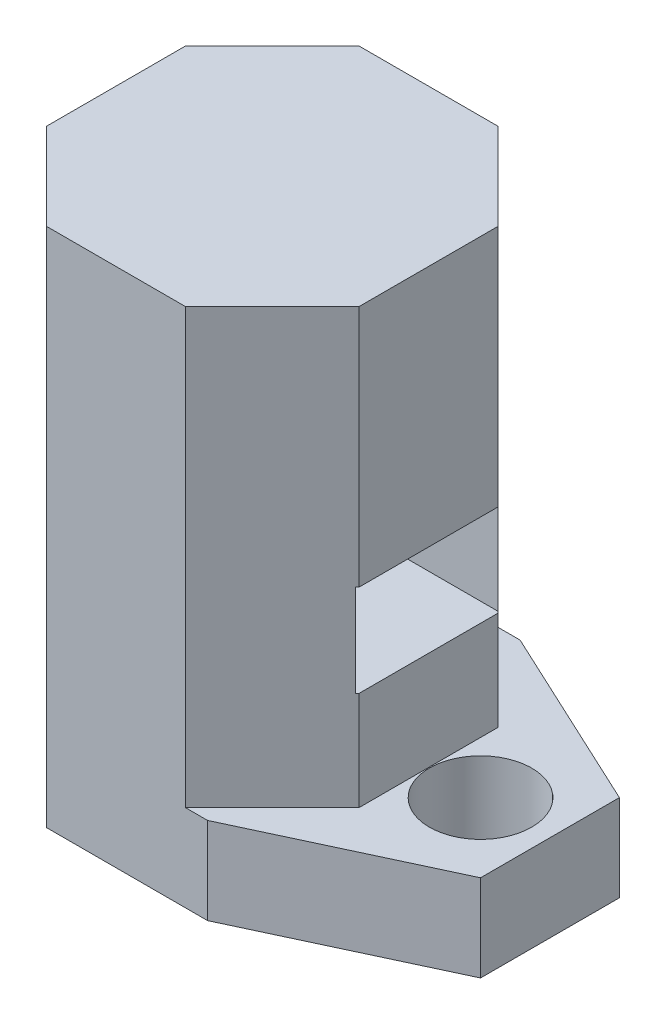
ISO-10303-21;
HEADER;
FILE_DESCRIPTION(('STEP AP214'),'2;1');
FILE_NAME('part.step','',(''),(''),'','','');
FILE_SCHEMA(('AUTOMOTIVE_DESIGN { 1 0 10303 214 1 1 1 1 }'));
ENDSEC;
DATA;
#1=APPLICATION_CONTEXT('core data for automotive mechanical design processes');
#2=APPLICATION_PROTOCOL_DEFINITION('international standard','automotive_design',2000,#1);
#3=PRODUCT_CONTEXT('',#1,'mechanical');
#4=PRODUCT('Part','Part','',(#3));
#5=PRODUCT_RELATED_PRODUCT_CATEGORY('part','',(#4));
#6=PRODUCT_DEFINITION_FORMATION('','',#4);
#7=PRODUCT_DEFINITION_CONTEXT('part definition',#1,'design');
#8=PRODUCT_DEFINITION('design','',#6,#7);
#9=PRODUCT_DEFINITION_SHAPE('','',#8);
#10=(LENGTH_UNIT() NAMED_UNIT(*) SI_UNIT(.MILLI.,.METRE.));
#11=(NAMED_UNIT(*) PLANE_ANGLE_UNIT() SI_UNIT($,.RADIAN.));
#12=(NAMED_UNIT(*) SI_UNIT($,.STERADIAN.) SOLID_ANGLE_UNIT());
#13=UNCERTAINTY_MEASURE_WITH_UNIT(LENGTH_MEASURE(1.E-05),#10,'distance_accuracy_value','');
#14=(GEOMETRIC_REPRESENTATION_CONTEXT(3) GLOBAL_UNCERTAINTY_ASSIGNED_CONTEXT((#13)) GLOBAL_UNIT_ASSIGNED_CONTEXT((#10,
#11,#12)) REPRESENTATION_CONTEXT('',''));
#15=CARTESIAN_POINT('',(0.,0.,0.));
#16=DIRECTION('',(0.,0.,1.));
#17=DIRECTION('',(1.,0.,0.));
#18=AXIS2_PLACEMENT_3D('',#15,#16,#17);
#19=CARTESIAN_POINT('',(3.99999999999999,0.,9.));
#20=DIRECTION('',(-1.,0.,0.));
#21=DIRECTION('',(0.,-1.,0.));
#22=AXIS2_PLACEMENT_3D('',#19,#20,#21);
#23=PLANE('',#22);
#24=DIRECTION('',(0.,0.,-1.));
#25=VECTOR('',#24,1.);
#26=CARTESIAN_POINT('',(4.,-25.,3.99999999999998));
#27=LINE('',#26,#25);
#28=CARTESIAN_POINT('',(4.,-25.,3.99999999999998));
#29=VERTEX_POINT('',#28);
#30=CARTESIAN_POINT('',(4.,-25.,-3.99999999999999));
#31=VERTEX_POINT('',#30);
#32=EDGE_CURVE('E380',#29,#31,#27,.T.);
#33=ORIENTED_EDGE('',*,*,#32,.T.);
#34=DIRECTION('',(0.,1.,0.));
#35=VECTOR('',#34,1.);
#36=CARTESIAN_POINT('',(3.99999999999999,0.,-3.99999999999991));
#37=LINE('',#36,#35);
#38=CARTESIAN_POINT('',(3.99999999999999,-19.3,-3.99999999999992));
#39=VERTEX_POINT('',#38);
#40=EDGE_CURVE('E187',#31,#39,#37,.T.);
#41=ORIENTED_EDGE('',*,*,#40,.T.);
#42=DIRECTION('',(0.,0.,-1.));
#43=VECTOR('',#42,1.);
#44=CARTESIAN_POINT('',(3.99999999999999,-19.3,4.1));
#45=LINE('',#44,#43);
#46=CARTESIAN_POINT('',(3.99999999999999,-19.3,3.99999999999996));
#47=VERTEX_POINT('',#46);
#48=EDGE_CURVE('E346',#47,#39,#45,.T.);
#49=ORIENTED_EDGE('',*,*,#48,.F.);
#50=DIRECTION('',(0.,-1.,0.));
#51=VECTOR('',#50,1.);
#52=CARTESIAN_POINT('',(3.99999999999999,0.,3.99999999999996));
#53=LINE('',#52,#51);
#54=EDGE_CURVE('E197',#47,#29,#53,.T.);
#55=ORIENTED_EDGE('',*,*,#54,.T.);
#56=EDGE_LOOP('',(#33,#41,#49,#55));
#57=FACE_BOUND('',#56,.T.);
#58=ADVANCED_FACE('F33',(#57),#23,.F.);
#59=CARTESIAN_POINT('',(3.99999999999999,0.,-3.99999999999991));
#60=DIRECTION('',(0.707106781186551,0.,-0.707106781186544));
#61=DIRECTION('',(0.,-1.,0.));
#62=AXIS2_PLACEMENT_3D('',#59,#60,#61);
#63=PLANE('',#62);
#64=ORIENTED_EDGE('',*,*,#40,.F.);
#65=DIRECTION('',(-0.707106781186549,0.,-0.707106781186547));
#66=VECTOR('',#65,1.);
#67=CARTESIAN_POINT('',(4.,-25.,-3.99999999999999));
#68=LINE('',#67,#66);
#69=CARTESIAN_POINT('',(-1.00000000000002,-25.,-9.));
#70=VERTEX_POINT('',#69);
#71=EDGE_CURVE('E171',#31,#70,#68,.T.);
#72=ORIENTED_EDGE('',*,*,#71,.T.);
#73=DIRECTION('',(0.,-1.,0.));
#74=VECTOR('',#73,1.);
#75=CARTESIAN_POINT('',(-1.00000000000004,-30.,-9.));
#76=LINE('',#75,#74);
#77=CARTESIAN_POINT('',(-1.00000000000004,0.,-9.));
#78=VERTEX_POINT('',#77);
#79=EDGE_CURVE('E185',#78,#70,#76,.T.);
#80=ORIENTED_EDGE('',*,*,#79,.F.);
#81=DIRECTION('',(-0.707106781186544,0.,-0.707106781186551));
#82=VECTOR('',#81,1.);
#83=CARTESIAN_POINT('',(3.99999999999999,0.,-3.99999999999991));
#84=LINE('',#83,#82);
#85=CARTESIAN_POINT('',(3.99999999999999,0.,-3.99999999999991));
#86=VERTEX_POINT('',#85);
#87=EDGE_CURVE('E302',#86,#78,#84,.T.);
#88=ORIENTED_EDGE('',*,*,#87,.F.);
#89=DIRECTION('',(0.,1.,0.));
#90=VECTOR('',#89,1.);
#91=CARTESIAN_POINT('',(3.99999999999999,0.,-3.99999999999991));
#92=LINE('',#91,#90);
#93=CARTESIAN_POINT('',(3.99999999999999,-14.,-3.99999999999991));
#94=VERTEX_POINT('',#93);
#95=EDGE_CURVE('E207',#94,#86,#92,.T.);
#96=ORIENTED_EDGE('',*,*,#95,.F.);
#97=DIRECTION('',(0.707106781186544,0.,0.707106781186551));
#98=VECTOR('',#97,1.);
#99=CARTESIAN_POINT('',(3.99999999999999,-14.,-3.99999999999991));
#100=LINE('',#99,#98);
#101=CARTESIAN_POINT('',(3.8999999999999,-14.,-4.1));
#102=VERTEX_POINT('',#101);
#103=EDGE_CURVE('E294',#102,#94,#100,.T.);
#104=ORIENTED_EDGE('',*,*,#103,.F.);
#105=DIRECTION('',(0.,1.,0.));
#106=VECTOR('',#105,1.);
#107=CARTESIAN_POINT('',(3.89999999999991,0.,-4.1));
#108=LINE('',#107,#106);
#109=CARTESIAN_POINT('',(3.89999999999991,-19.3,-4.1));
#110=VERTEX_POINT('',#109);
#111=EDGE_CURVE('E199',#110,#102,#108,.T.);
#112=ORIENTED_EDGE('',*,*,#111,.F.);
#113=DIRECTION('',(-0.707106781186544,0.,-0.707106781186551));
#114=VECTOR('',#113,1.);
#115=CARTESIAN_POINT('',(3.99999999999999,-19.3,-3.99999999999992));
#116=LINE('',#115,#114);
#117=EDGE_CURVE('E282',#39,#110,#116,.T.);
#118=ORIENTED_EDGE('',*,*,#117,.F.);
#119=EDGE_LOOP('',(#64,#72,#80,#88,#96,#104,#112,#118));
#120=FACE_BOUND('',#119,.T.);
#121=ADVANCED_FACE('F183',(#120),#63,.T.);
#122=CARTESIAN_POINT('',(-1.0000000000001,0.,9.));
#123=DIRECTION('',(-0.707106781186544,0.,-0.707106781186551));
#124=DIRECTION('',(0.,1.,0.));
#125=AXIS2_PLACEMENT_3D('',#122,#123,#124);
#126=PLANE('',#125);
#127=DIRECTION('',(0.,1.,0.));
#128=VECTOR('',#127,1.);
#129=CARTESIAN_POINT('',(-1.0000000000001,0.,9.));
#130=LINE('',#129,#128);
#131=CARTESIAN_POINT('',(-1.00000000000001,-25.,9.));
#132=VERTEX_POINT('',#131);
#133=CARTESIAN_POINT('',(-1.0000000000001,0.,9.));
#134=VERTEX_POINT('',#133);
#135=EDGE_CURVE('E258',#132,#134,#130,.T.);
#136=ORIENTED_EDGE('',*,*,#135,.F.);
#137=DIRECTION('',(0.707106781186546,0.,-0.707106781186549));
#138=VECTOR('',#137,1.);
#139=CARTESIAN_POINT('',(-1.00000000000001,-25.,9.));
#140=LINE('',#139,#138);
#141=EDGE_CURVE('E384',#132,#29,#140,.T.);
#142=ORIENTED_EDGE('',*,*,#141,.T.);
#143=ORIENTED_EDGE('',*,*,#54,.F.);
#144=DIRECTION('',(-0.707106781186551,0.,0.707106781186544));
#145=VECTOR('',#144,1.);
#146=CARTESIAN_POINT('',(-1.00000000000009,-19.3,9.));
#147=LINE('',#146,#145);
#148=CARTESIAN_POINT('',(3.89999999999996,-19.3,4.1));
#149=VERTEX_POINT('',#148);
#150=EDGE_CURVE('E280',#149,#47,#147,.F.);
#151=ORIENTED_EDGE('',*,*,#150,.F.);
#152=DIRECTION('',(0.,1.,0.));
#153=VECTOR('',#152,1.);
#154=CARTESIAN_POINT('',(3.89999999999995,0.,4.1));
#155=LINE('',#154,#153);
#156=CARTESIAN_POINT('',(3.89999999999996,-14.,4.1));
#157=VERTEX_POINT('',#156);
#158=EDGE_CURVE('E288',#157,#149,#155,.F.);
#159=ORIENTED_EDGE('',*,*,#158,.F.);
#160=DIRECTION('',(0.707106781186551,0.,-0.707106781186544));
#161=VECTOR('',#160,1.);
#162=CARTESIAN_POINT('',(-1.00000000000009,-14.,9.));
#163=LINE('',#162,#161);
#164=CARTESIAN_POINT('',(3.99999999999999,-14.,3.99999999999996));
#165=VERTEX_POINT('',#164);
#166=EDGE_CURVE('E292',#165,#157,#163,.F.);
#167=ORIENTED_EDGE('',*,*,#166,.F.);
#168=DIRECTION('',(0.,-1.,0.));
#169=VECTOR('',#168,1.);
#170=CARTESIAN_POINT('',(3.99999999999999,0.,3.99999999999996));
#171=LINE('',#170,#169);
#172=CARTESIAN_POINT('',(3.99999999999999,0.,3.99999999999996));
#173=VERTEX_POINT('',#172);
#174=EDGE_CURVE('E205',#173,#165,#171,.T.);
#175=ORIENTED_EDGE('',*,*,#174,.F.);
#176=DIRECTION('',(-0.707106781186551,0.,0.707106781186544));
#177=VECTOR('',#176,1.);
#178=CARTESIAN_POINT('',(-1.0000000000001,0.,9.));
#179=LINE('',#178,#177);
#180=EDGE_CURVE('E300',#134,#173,#179,.F.);
#181=ORIENTED_EDGE('',*,*,#180,.F.);
#182=EDGE_LOOP('',(#136,#142,#143,#151,#159,#167,#175,#181));
#183=FACE_BOUND('',#182,.T.);
#184=ADVANCED_FACE('F340',(#183),#126,.F.);
#185=CARTESIAN_POINT('',(-14.,-30.,9.));
#186=DIRECTION('',(1.,0.,0.));
#187=DIRECTION('',(0.,1.,0.));
#188=AXIS2_PLACEMENT_3D('',#185,#186,#187);
#189=PLANE('',#188);
#190=DIRECTION('',(0.,0.,-1.));
#191=VECTOR('',#190,1.);
#192=CARTESIAN_POINT('',(-14.,-30.,9.));
#193=LINE('',#192,#191);
#194=CARTESIAN_POINT('',(-14.,-30.,3.99999999999996));
#195=VERTEX_POINT('',#194);
#196=CARTESIAN_POINT('',(-14.,-30.,-3.99999999999991));
#197=VERTEX_POINT('',#196);
#198=EDGE_CURVE('E253',#195,#197,#193,.T.);
#199=ORIENTED_EDGE('',*,*,#198,.F.);
#200=DIRECTION('',(0.,1.,0.));
#201=VECTOR('',#200,1.);
#202=CARTESIAN_POINT('',(-14.,-30.,3.99999999999996));
#203=LINE('',#202,#201);
#204=CARTESIAN_POINT('',(-14.,-19.3,3.99999999999996));
#205=VERTEX_POINT('',#204);
#206=EDGE_CURVE('E278',#195,#205,#203,.T.);
#207=ORIENTED_EDGE('',*,*,#206,.T.);
#208=DIRECTION('',(0.,0.,1.));
#209=VECTOR('',#208,1.);
#210=CARTESIAN_POINT('',(-14.,-19.3,4.1));
#211=LINE('',#210,#209);
#212=CARTESIAN_POINT('',(-14.,-19.3,-3.99999999999991));
#213=VERTEX_POINT('',#212);
#214=EDGE_CURVE('E360',#213,#205,#211,.T.);
#215=ORIENTED_EDGE('',*,*,#214,.F.);
#216=DIRECTION('',(0.,-1.,0.));
#217=VECTOR('',#216,1.);
#218=CARTESIAN_POINT('',(-14.,-30.,-3.99999999999991));
#219=LINE('',#218,#217);
#220=EDGE_CURVE('E271',#213,#197,#219,.T.);
#221=ORIENTED_EDGE('',*,*,#220,.T.);
#222=EDGE_LOOP('',(#199,#207,#215,#221));
#223=FACE_BOUND('',#222,.T.);
#224=ADVANCED_FACE('F405',(#223),#189,.F.);
#225=CARTESIAN_POINT('',(-14.,0.,9.));
#226=DIRECTION('',(0.,-1.,0.));
#227=DIRECTION('',(1.,0.,0.));
#228=AXIS2_PLACEMENT_3D('',#225,#226,#227);
#229=PLANE('',#228);
#230=DIRECTION('',(0.,0.,-1.));
#231=VECTOR('',#230,1.);
#232=CARTESIAN_POINT('',(-14.,0.,9.));
#233=LINE('',#232,#231);
#234=CARTESIAN_POINT('',(-14.,0.,3.99999999999996));
#235=VERTEX_POINT('',#234);
#236=CARTESIAN_POINT('',(-14.,0.,-3.99999999999991));
#237=VERTEX_POINT('',#236);
#238=EDGE_CURVE('E255',#235,#237,#233,.T.);
#239=ORIENTED_EDGE('',*,*,#238,.F.);
#240=DIRECTION('',(-0.707106781186551,0.,-0.707106781186544));
#241=VECTOR('',#240,1.);
#242=CARTESIAN_POINT('',(-8.99999999999991,0.,9.));
#243=LINE('',#242,#241);
#244=CARTESIAN_POINT('',(-8.99999999999991,0.,9.));
#245=VERTEX_POINT('',#244);
#246=EDGE_CURVE('E306',#235,#245,#243,.F.);
#247=ORIENTED_EDGE('',*,*,#246,.T.);
#248=DIRECTION('',(-1.,0.,0.));
#249=VECTOR('',#248,1.);
#250=CARTESIAN_POINT('',(-14.,0.,9.));
#251=LINE('',#250,#249);
#252=EDGE_CURVE('E241',#134,#245,#251,.T.);
#253=ORIENTED_EDGE('',*,*,#252,.F.);
#254=ORIENTED_EDGE('',*,*,#180,.T.);
#255=DIRECTION('',(0.,0.,-1.));
#256=VECTOR('',#255,1.);
#257=CARTESIAN_POINT('',(3.99999999999999,0.,9.));
#258=LINE('',#257,#256);
#259=EDGE_CURVE('E250',#173,#86,#258,.T.);
#260=ORIENTED_EDGE('',*,*,#259,.T.);
#261=ORIENTED_EDGE('',*,*,#87,.T.);
#262=DIRECTION('',(-1.,0.,0.));
#263=VECTOR('',#262,1.);
#264=CARTESIAN_POINT('',(-14.,0.,-9.));
#265=LINE('',#264,#263);
#266=CARTESIAN_POINT('',(-8.99999999999996,0.,-9.));
#267=VERTEX_POINT('',#266);
#268=EDGE_CURVE('E193',#78,#267,#265,.T.);
#269=ORIENTED_EDGE('',*,*,#268,.T.);
#270=DIRECTION('',(-0.707106781186544,0.,0.707106781186551));
#271=VECTOR('',#270,1.);
#272=CARTESIAN_POINT('',(-14.,0.,-3.99999999999991));
#273=LINE('',#272,#271);
#274=EDGE_CURVE('E304',#267,#237,#273,.T.);
#275=ORIENTED_EDGE('',*,*,#274,.T.);
#276=EDGE_LOOP('',(#239,#247,#253,#254,#260,#261,#269,#275));
#277=FACE_BOUND('',#276,.T.);
#278=ADVANCED_FACE('F335',(#277),#229,.F.);
#279=DIRECTION('',(0.,0.,-1.));
#280=VECTOR('',#279,1.);
#281=CARTESIAN_POINT('',(-14.,-14.,4.1));
#282=LINE('',#281,#280);
#283=CARTESIAN_POINT('',(-14.,-14.,3.99999999999996));
#284=VERTEX_POINT('',#283);
#285=CARTESIAN_POINT('',(-14.,-14.,-3.99999999999991));
#286=VERTEX_POINT('',#285);
#287=EDGE_CURVE('E351',#284,#286,#282,.T.);
#288=ORIENTED_EDGE('',*,*,#287,.F.);
#289=DIRECTION('',(0.,1.,0.));
#290=VECTOR('',#289,1.);
#291=CARTESIAN_POINT('',(-14.,-30.,3.99999999999996));
#292=LINE('',#291,#290);
#293=EDGE_CURVE('E276',#284,#235,#292,.T.);
#294=ORIENTED_EDGE('',*,*,#293,.T.);
#295=ORIENTED_EDGE('',*,*,#238,.T.);
#296=DIRECTION('',(0.,-1.,0.));
#297=VECTOR('',#296,1.);
#298=CARTESIAN_POINT('',(-14.,-30.,-3.99999999999991));
#299=LINE('',#298,#297);
#300=EDGE_CURVE('E273',#237,#286,#299,.T.);
#301=ORIENTED_EDGE('',*,*,#300,.T.);
#302=EDGE_LOOP('',(#288,#294,#295,#301));
#303=FACE_BOUND('',#302,.T.);
#304=ADVANCED_FACE('F395',(#303),#189,.F.);
#305=CARTESIAN_POINT('',(4.,-30.,9.));
#306=DIRECTION('',(0.,1.,0.));
#307=DIRECTION('',(-1.,0.,0.));
#308=AXIS2_PLACEMENT_3D('',#305,#306,#307);
#309=PLANE('',#308);
#310=CARTESIAN_POINT('',(-5.,-30.,0.));
#311=DIRECTION('',(0.,-1.,0.));
#312=DIRECTION('',(1.,0.,0.));
#313=AXIS2_PLACEMENT_3D('',#310,#311,#312);
#314=CIRCLE('',#313,5.25);
#315=CARTESIAN_POINT('',(0.249999999999997,-30.,0.));
#316=VERTEX_POINT('',#315);
#317=EDGE_CURVE('E262',#316,#316,#314,.T.);
#318=ORIENTED_EDGE('',*,*,#317,.F.);
#319=EDGE_LOOP('',(#318));
#320=FACE_BOUND('',#319,.T.);
#321=DIRECTION('',(1.,0.,0.));
#322=VECTOR('',#321,1.);
#323=CARTESIAN_POINT('',(4.,-30.,-9.));
#324=LINE('',#323,#322);
#325=CARTESIAN_POINT('',(-8.99999999999997,-30.,-9.));
#326=VERTEX_POINT('',#325);
#327=CARTESIAN_POINT('',(0.277465397452219,-30.,-9.));
#328=VERTEX_POINT('',#327);
#329=EDGE_CURVE('E233',#326,#328,#324,.T.);
#330=ORIENTED_EDGE('',*,*,#329,.T.);
#331=DIRECTION('',(-0.90630778703665,0.,-0.4226182617407));
#332=VECTOR('',#331,1.);
#333=CARTESIAN_POINT('',(0.277465397452216,-30.,-9.));
#334=LINE('',#333,#332);
#335=CARTESIAN_POINT('',(11.,-30.,-3.99999999999999));
#336=VERTEX_POINT('',#335);
#337=EDGE_CURVE('E214',#328,#336,#334,.F.);
#338=ORIENTED_EDGE('',*,*,#337,.T.);
#339=DIRECTION('',(0.,0.,1.));
#340=VECTOR('',#339,1.);
#341=CARTESIAN_POINT('',(11.,-30.,-9.));
#342=LINE('',#341,#340);
#343=CARTESIAN_POINT('',(11.,-30.,3.99999999999999));
#344=VERTEX_POINT('',#343);
#345=EDGE_CURVE('E188',#336,#344,#342,.T.);
#346=ORIENTED_EDGE('',*,*,#345,.T.);
#347=DIRECTION('',(-0.90630778703665,0.,0.4226182617407));
#348=VECTOR('',#347,1.);
#349=CARTESIAN_POINT('',(11.,-30.,3.99999999999999));
#350=LINE('',#349,#348);
#351=CARTESIAN_POINT('',(0.277465397452216,-30.,9.));
#352=VERTEX_POINT('',#351);
#353=EDGE_CURVE('E212',#344,#352,#350,.T.);
#354=ORIENTED_EDGE('',*,*,#353,.T.);
#355=DIRECTION('',(1.,0.,0.));
#356=VECTOR('',#355,1.);
#357=CARTESIAN_POINT('',(4.,-30.,9.));
#358=LINE('',#357,#356);
#359=CARTESIAN_POINT('',(-8.99999999999991,-30.,9.));
#360=VERTEX_POINT('',#359);
#361=EDGE_CURVE('E244',#360,#352,#358,.T.);
#362=ORIENTED_EDGE('',*,*,#361,.F.);
#363=DIRECTION('',(0.707106781186551,0.,0.707106781186544));
#364=VECTOR('',#363,1.);
#365=CARTESIAN_POINT('',(-8.99999999999991,-30.,9.00000000000001));
#366=LINE('',#365,#364);
#367=EDGE_CURVE('E269',#360,#195,#366,.F.);
#368=ORIENTED_EDGE('',*,*,#367,.T.);
#369=ORIENTED_EDGE('',*,*,#198,.T.);
#370=DIRECTION('',(0.707106781186544,0.,-0.707106781186551));
#371=VECTOR('',#370,1.);
#372=CARTESIAN_POINT('',(-14.,-30.,-3.99999999999991));
#373=LINE('',#372,#371);
#374=EDGE_CURVE('E240',#197,#326,#373,.T.);
#375=ORIENTED_EDGE('',*,*,#374,.T.);
#376=EDGE_LOOP('',(#330,#338,#346,#354,#362,#368,#369,#375));
#377=FACE_BOUND('',#376,.T.);
#378=CARTESIAN_POINT('',(7.,-30.,0.));
#379=DIRECTION('',(0.,-1.,0.));
#380=DIRECTION('',(1.,0.,0.));
#381=AXIS2_PLACEMENT_3D('',#378,#379,#380);
#382=CIRCLE('',#381,2.95);
#383=CARTESIAN_POINT('',(9.95,-30.,0.));
#384=VERTEX_POINT('',#383);
#385=EDGE_CURVE('E376',#384,#384,#382,.T.);
#386=ORIENTED_EDGE('',*,*,#385,.F.);
#387=EDGE_LOOP('',(#386));
#388=FACE_BOUND('',#387,.T.);
#389=ADVANCED_FACE('F236',(#320,#377,#388),#309,.F.);
#390=DIRECTION('',(0.,0.,1.));
#391=VECTOR('',#390,1.);
#392=CARTESIAN_POINT('',(3.99999999999999,-14.,4.1));
#393=LINE('',#392,#391);
#394=EDGE_CURVE('E332',#94,#165,#393,.T.);
#395=ORIENTED_EDGE('',*,*,#394,.F.);
#396=ORIENTED_EDGE('',*,*,#95,.T.);
#397=ORIENTED_EDGE('',*,*,#259,.F.);
#398=ORIENTED_EDGE('',*,*,#174,.T.);
#399=EDGE_LOOP('',(#395,#396,#397,#398));
#400=FACE_BOUND('',#399,.T.);
#401=ADVANCED_FACE('F330',(#400),#23,.F.);
#402=CARTESIAN_POINT('',(0.,0.,9.));
#403=DIRECTION('',(0.,0.,-1.));
#404=DIRECTION('',(-1.,0.,0.));
#405=AXIS2_PLACEMENT_3D('',#402,#403,#404);
#406=PLANE('',#405);
#407=ORIENTED_EDGE('',*,*,#361,.T.);
#408=DIRECTION('',(0.,1.,0.));
#409=VECTOR('',#408,1.);
#410=CARTESIAN_POINT('',(0.277465397452215,-25.,9.));
#411=LINE('',#410,#409);
#412=CARTESIAN_POINT('',(0.277465397452212,-25.,9.));
#413=VERTEX_POINT('',#412);
#414=EDGE_CURVE('E11',#352,#413,#411,.T.);
#415=ORIENTED_EDGE('',*,*,#414,.T.);
#416=DIRECTION('',(-1.,0.,0.));
#417=VECTOR('',#416,1.);
#418=CARTESIAN_POINT('',(-1.00000000000001,-25.,9.));
#419=LINE('',#418,#417);
#420=EDGE_CURVE('E228',#413,#132,#419,.T.);
#421=ORIENTED_EDGE('',*,*,#420,.T.);
#422=ORIENTED_EDGE('',*,*,#135,.T.);
#423=ORIENTED_EDGE('',*,*,#252,.T.);
#424=DIRECTION('',(0.,-1.,0.));
#425=VECTOR('',#424,1.);
#426=CARTESIAN_POINT('',(-8.99999999999991,0.,9.));
#427=LINE('',#426,#425);
#428=EDGE_CURVE('E265',#245,#360,#427,.T.);
#429=ORIENTED_EDGE('',*,*,#428,.T.);
#430=EDGE_LOOP('',(#407,#415,#421,#422,#423,#429));
#431=FACE_BOUND('',#430,.T.);
#432=ADVANCED_FACE('F370',(#431),#406,.F.);
#433=CARTESIAN_POINT('',(0.,0.,-9.));
#434=DIRECTION('',(0.,0.,-1.));
#435=DIRECTION('',(-1.,0.,0.));
#436=AXIS2_PLACEMENT_3D('',#433,#434,#435);
#437=PLANE('',#436);
#438=DIRECTION('',(1.,0.,0.));
#439=VECTOR('',#438,1.);
#440=CARTESIAN_POINT('',(-1.00000000000002,-25.,-9.));
#441=LINE('',#440,#439);
#442=CARTESIAN_POINT('',(0.277465397452208,-25.,-9.));
#443=VERTEX_POINT('',#442);
#444=EDGE_CURVE('E168',#70,#443,#441,.T.);
#445=ORIENTED_EDGE('',*,*,#444,.T.);
#446=DIRECTION('',(0.,-1.,0.));
#447=VECTOR('',#446,1.);
#448=CARTESIAN_POINT('',(0.277465397452205,0.,-9.));
#449=LINE('',#448,#447);
#450=EDGE_CURVE('E210',#443,#328,#449,.T.);
#451=ORIENTED_EDGE('',*,*,#450,.T.);
#452=ORIENTED_EDGE('',*,*,#329,.F.);
#453=DIRECTION('',(0.,1.,0.));
#454=VECTOR('',#453,1.);
#455=CARTESIAN_POINT('',(-8.99999999999996,0.,-9.));
#456=LINE('',#455,#454);
#457=EDGE_CURVE('E194',#326,#267,#456,.T.);
#458=ORIENTED_EDGE('',*,*,#457,.T.);
#459=ORIENTED_EDGE('',*,*,#268,.F.);
#460=ORIENTED_EDGE('',*,*,#79,.T.);
#461=EDGE_LOOP('',(#445,#451,#452,#458,#459,#460));
#462=FACE_BOUND('',#461,.T.);
#463=ADVANCED_FACE('F191',(#462),#437,.T.);
#464=CARTESIAN_POINT('',(-5.00000000000001,-24.,0.));
#465=DIRECTION('',(0.,-1.,0.));
#466=DIRECTION('',(1.,0.,0.));
#467=AXIS2_PLACEMENT_3D('',#464,#465,#466);
#468=CYLINDRICAL_SURFACE('',#467,5.25);
#469=CARTESIAN_POINT('',(-5.00000000000001,-24.,0.));
#470=DIRECTION('',(0.,-1.,0.));
#471=DIRECTION('',(1.,0.,0.));
#472=AXIS2_PLACEMENT_3D('',#469,#470,#471);
#473=CIRCLE('',#472,5.25);
#474=CARTESIAN_POINT('',(0.249999999999995,-24.,0.));
#475=VERTEX_POINT('',#474);
#476=EDGE_CURVE('E246',#475,#475,#473,.T.);
#477=ORIENTED_EDGE('',*,*,#476,.F.);
#478=EDGE_LOOP('',(#477));
#479=FACE_BOUND('',#478,.T.);
#480=ORIENTED_EDGE('',*,*,#317,.T.);
#481=EDGE_LOOP('',(#480));
#482=FACE_BOUND('',#481,.T.);
#483=ADVANCED_FACE('F415',(#479,#482),#468,.F.);
#484=CARTESIAN_POINT('',(-5.00000000000001,-24.,0.));
#485=DIRECTION('',(0.,-1.,0.));
#486=DIRECTION('',(1.,0.,0.));
#487=AXIS2_PLACEMENT_3D('',#484,#485,#486);
#488=PLANE('',#487);
#489=CARTESIAN_POINT('',(-5.,-24.,0.));
#490=DIRECTION('',(0.,-1.,0.));
#491=DIRECTION('',(1.,0.,0.));
#492=AXIS2_PLACEMENT_3D('',#489,#490,#491);
#493=CIRCLE('',#492,2.75);
#494=CARTESIAN_POINT('',(-2.25,-24.,0.));
#495=VERTEX_POINT('',#494);
#496=EDGE_CURVE('E259',#495,#495,#493,.T.);
#497=ORIENTED_EDGE('',*,*,#496,.F.);
#498=EDGE_LOOP('',(#497));
#499=FACE_BOUND('',#498,.T.);
#500=ORIENTED_EDGE('',*,*,#476,.T.);
#501=EDGE_LOOP('',(#500));
#502=FACE_BOUND('',#501,.T.);
#503=ADVANCED_FACE('F420',(#499,#502),#488,.T.);
#504=CARTESIAN_POINT('',(-5.00000000000001,-1.99999999999999,0.));
#505=DIRECTION('',(0.,-1.,0.));
#506=DIRECTION('',(1.,0.,0.));
#507=AXIS2_PLACEMENT_3D('',#504,#505,#506);
#508=CYLINDRICAL_SURFACE('',#507,2.75);
#509=CARTESIAN_POINT('',(-5.00000000000001,-19.3,0.));
#510=DIRECTION('',(0.,-1.,0.));
#511=DIRECTION('',(0.,0.,-1.));
#512=AXIS2_PLACEMENT_3D('',#509,#510,#511);
#513=CIRCLE('',#512,2.75);
#514=CARTESIAN_POINT('',(-5.00000000000001,-19.3,-2.75));
#515=VERTEX_POINT('',#514);
#516=EDGE_CURVE('E355',#515,#515,#513,.T.);
#517=ORIENTED_EDGE('',*,*,#516,.F.);
#518=EDGE_LOOP('',(#517));
#519=FACE_BOUND('',#518,.T.);
#520=ORIENTED_EDGE('',*,*,#496,.T.);
#521=EDGE_LOOP('',(#520));
#522=FACE_BOUND('',#521,.T.);
#523=ADVANCED_FACE('F424',(#519,#522),#508,.F.);
#524=CARTESIAN_POINT('',(-14.001,-14.,4.1));
#525=DIRECTION('',(0.,0.,1.));
#526=DIRECTION('',(0.,-1.,0.));
#527=AXIS2_PLACEMENT_3D('',#524,#525,#526);
#528=PLANE('',#527);
#529=DIRECTION('',(1.,0.,0.));
#530=VECTOR('',#529,1.);
#531=CARTESIAN_POINT('',(-14.001,-19.3,4.1));
#532=LINE('',#531,#530);
#533=CARTESIAN_POINT('',(-13.9,-19.3,4.1));
#534=VERTEX_POINT('',#533);
#535=EDGE_CURVE('E345',#534,#149,#532,.T.);
#536=ORIENTED_EDGE('',*,*,#535,.F.);
#537=DIRECTION('',(0.,-1.,0.));
#538=VECTOR('',#537,1.);
#539=CARTESIAN_POINT('',(-13.9,0.,4.1));
#540=LINE('',#539,#538);
#541=CARTESIAN_POINT('',(-13.9,-14.,4.1));
#542=VERTEX_POINT('',#541);
#543=EDGE_CURVE('E290',#534,#542,#540,.F.);
#544=ORIENTED_EDGE('',*,*,#543,.T.);
#545=DIRECTION('',(1.,0.,0.));
#546=VECTOR('',#545,1.);
#547=CARTESIAN_POINT('',(-14.001,-14.,4.1));
#548=LINE('',#547,#546);
#549=EDGE_CURVE('E325',#542,#157,#548,.T.);
#550=ORIENTED_EDGE('',*,*,#549,.T.);
#551=ORIENTED_EDGE('',*,*,#158,.T.);
#552=EDGE_LOOP('',(#536,#544,#550,#551));
#553=FACE_BOUND('',#552,.T.);
#554=ADVANCED_FACE('F428',(#553),#528,.F.);
#555=CARTESIAN_POINT('',(-14.001,-14.,-4.1));
#556=DIRECTION('',(0.,0.,-1.));
#557=DIRECTION('',(0.,1.,0.));
#558=AXIS2_PLACEMENT_3D('',#555,#556,#557);
#559=PLANE('',#558);
#560=DIRECTION('',(1.,0.,0.));
#561=VECTOR('',#560,1.);
#562=CARTESIAN_POINT('',(-14.001,-14.,-4.1));
#563=LINE('',#562,#561);
#564=CARTESIAN_POINT('',(-13.8999999999999,-14.,-4.1));
#565=VERTEX_POINT('',#564);
#566=EDGE_CURVE('E313',#565,#102,#563,.T.);
#567=ORIENTED_EDGE('',*,*,#566,.F.);
#568=DIRECTION('',(0.,-1.,0.));
#569=VECTOR('',#568,1.);
#570=CARTESIAN_POINT('',(-13.8999999999999,-30.,-4.1));
#571=LINE('',#570,#569);
#572=CARTESIAN_POINT('',(-13.8999999999999,-19.3,-4.1));
#573=VERTEX_POINT('',#572);
#574=EDGE_CURVE('E195',#565,#573,#571,.T.);
#575=ORIENTED_EDGE('',*,*,#574,.T.);
#576=DIRECTION('',(1.,0.,0.));
#577=VECTOR('',#576,1.);
#578=CARTESIAN_POINT('',(-14.001,-19.3,-4.1));
#579=LINE('',#578,#577);
#580=EDGE_CURVE('E316',#573,#110,#579,.T.);
#581=ORIENTED_EDGE('',*,*,#580,.T.);
#582=ORIENTED_EDGE('',*,*,#111,.T.);
#583=EDGE_LOOP('',(#567,#575,#581,#582));
#584=FACE_BOUND('',#583,.T.);
#585=ADVANCED_FACE('F312',(#584),#559,.F.);
#586=CARTESIAN_POINT('',(-14.001,-14.,4.1));
#587=DIRECTION('',(0.,1.,0.));
#588=DIRECTION('',(0.,0.,1.));
#589=AXIS2_PLACEMENT_3D('',#586,#587,#588);
#590=PLANE('',#589);
#591=ORIENTED_EDGE('',*,*,#549,.F.);
#592=DIRECTION('',(0.707106781186551,0.,0.707106781186544));
#593=VECTOR('',#592,1.);
#594=CARTESIAN_POINT('',(-8.99999999999991,-14.,9.));
#595=LINE('',#594,#593);
#596=EDGE_CURVE('E298',#542,#284,#595,.F.);
#597=ORIENTED_EDGE('',*,*,#596,.T.);
#598=ORIENTED_EDGE('',*,*,#287,.T.);
#599=DIRECTION('',(0.707106781186544,0.,-0.707106781186551));
#600=VECTOR('',#599,1.);
#601=CARTESIAN_POINT('',(-14.,-14.,-3.99999999999991));
#602=LINE('',#601,#600);
#603=EDGE_CURVE('E296',#286,#565,#602,.T.);
#604=ORIENTED_EDGE('',*,*,#603,.T.);
#605=ORIENTED_EDGE('',*,*,#566,.T.);
#606=ORIENTED_EDGE('',*,*,#103,.T.);
#607=ORIENTED_EDGE('',*,*,#394,.T.);
#608=ORIENTED_EDGE('',*,*,#166,.T.);
#609=EDGE_LOOP('',(#591,#597,#598,#604,#605,#606,#607,#608));
#610=FACE_BOUND('',#609,.T.);
#611=CARTESIAN_POINT('',(-5.00000000000001,-14.,0.));
#612=DIRECTION('',(0.,1.,0.));
#613=DIRECTION('',(0.,0.,1.));
#614=AXIS2_PLACEMENT_3D('',#611,#612,#613);
#615=CIRCLE('',#614,2.75);
#616=CARTESIAN_POINT('',(-5.00000000000001,-14.,2.75));
#617=VERTEX_POINT('',#616);
#618=EDGE_CURVE('E363',#617,#617,#615,.T.);
#619=ORIENTED_EDGE('',*,*,#618,.T.);
#620=EDGE_LOOP('',(#619));
#621=FACE_BOUND('',#620,.T.);
#622=ADVANCED_FACE('F320',(#610,#621),#590,.F.);
#623=CARTESIAN_POINT('',(-14.001,-19.3,4.1));
#624=DIRECTION('',(0.,-1.,0.));
#625=DIRECTION('',(0.,0.,-1.));
#626=AXIS2_PLACEMENT_3D('',#623,#624,#625);
#627=PLANE('',#626);
#628=ORIENTED_EDGE('',*,*,#214,.T.);
#629=DIRECTION('',(-0.707106781186551,0.,-0.707106781186544));
#630=VECTOR('',#629,1.);
#631=CARTESIAN_POINT('',(-8.99999999999992,-19.3,9.));
#632=LINE('',#631,#630);
#633=EDGE_CURVE('E286',#205,#534,#632,.F.);
#634=ORIENTED_EDGE('',*,*,#633,.T.);
#635=ORIENTED_EDGE('',*,*,#535,.T.);
#636=ORIENTED_EDGE('',*,*,#150,.T.);
#637=ORIENTED_EDGE('',*,*,#48,.T.);
#638=ORIENTED_EDGE('',*,*,#117,.T.);
#639=ORIENTED_EDGE('',*,*,#580,.F.);
#640=DIRECTION('',(-0.707106781186544,0.,0.707106781186551));
#641=VECTOR('',#640,1.);
#642=CARTESIAN_POINT('',(-14.,-19.3,-3.99999999999991));
#643=LINE('',#642,#641);
#644=EDGE_CURVE('E284',#573,#213,#643,.T.);
#645=ORIENTED_EDGE('',*,*,#644,.T.);
#646=EDGE_LOOP('',(#628,#634,#635,#636,#637,#638,#639,#645));
#647=FACE_BOUND('',#646,.T.);
#648=ORIENTED_EDGE('',*,*,#516,.T.);
#649=EDGE_LOOP('',(#648));
#650=FACE_BOUND('',#649,.T.);
#651=ADVANCED_FACE('F434',(#647,#650),#627,.F.);
#652=CARTESIAN_POINT('',(-5.00000000000001,-1.99999999999999,0.));
#653=DIRECTION('',(0.,-1.,0.));
#654=DIRECTION('',(1.,0.,0.));
#655=AXIS2_PLACEMENT_3D('',#652,#653,#654);
#656=PLANE('',#655);
#657=CARTESIAN_POINT('',(-5.00000000000001,-1.99999999999999,0.));
#658=DIRECTION('',(0.,-1.,0.));
#659=DIRECTION('',(1.,0.,0.));
#660=AXIS2_PLACEMENT_3D('',#657,#658,#659);
#661=CIRCLE('',#660,2.75);
#662=CARTESIAN_POINT('',(-2.25000000000001,-1.99999999999999,0.));
#663=VERTEX_POINT('',#662);
#664=EDGE_CURVE('E263',#663,#663,#661,.T.);
#665=ORIENTED_EDGE('',*,*,#664,.T.);
#666=EDGE_LOOP('',(#665));
#667=FACE_BOUND('',#666,.T.);
#668=ADVANCED_FACE('F431',(#667),#656,.T.);
#669=ORIENTED_EDGE('',*,*,#618,.F.);
#670=EDGE_LOOP('',(#669));
#671=FACE_BOUND('',#670,.T.);
#672=ORIENTED_EDGE('',*,*,#664,.F.);
#673=EDGE_LOOP('',(#672));
#674=FACE_BOUND('',#673,.T.);
#675=ADVANCED_FACE('F430',(#671,#674),#508,.F.);
#676=CARTESIAN_POINT('',(-8.99999999999991,0.,9.));
#677=DIRECTION('',(0.707106781186544,0.,-0.707106781186551));
#678=DIRECTION('',(0.,-1.,0.));
#679=AXIS2_PLACEMENT_3D('',#676,#677,#678);
#680=PLANE('',#679);
#681=ORIENTED_EDGE('',*,*,#633,.F.);
#682=ORIENTED_EDGE('',*,*,#206,.F.);
#683=ORIENTED_EDGE('',*,*,#367,.F.);
#684=ORIENTED_EDGE('',*,*,#428,.F.);
#685=ORIENTED_EDGE('',*,*,#246,.F.);
#686=ORIENTED_EDGE('',*,*,#293,.F.);
#687=ORIENTED_EDGE('',*,*,#596,.F.);
#688=ORIENTED_EDGE('',*,*,#543,.F.);
#689=EDGE_LOOP('',(#681,#682,#683,#684,#685,#686,#687,#688));
#690=FACE_BOUND('',#689,.T.);
#691=ADVANCED_FACE('F466',(#690),#680,.F.);
#692=CARTESIAN_POINT('',(-14.,-30.,-3.99999999999991));
#693=DIRECTION('',(-0.707106781186551,0.,-0.707106781186544));
#694=DIRECTION('',(0.,1.,0.));
#695=AXIS2_PLACEMENT_3D('',#692,#693,#694);
#696=PLANE('',#695);
#697=ORIENTED_EDGE('',*,*,#274,.F.);
#698=ORIENTED_EDGE('',*,*,#457,.F.);
#699=ORIENTED_EDGE('',*,*,#374,.F.);
#700=ORIENTED_EDGE('',*,*,#220,.F.);
#701=ORIENTED_EDGE('',*,*,#644,.F.);
#702=ORIENTED_EDGE('',*,*,#574,.F.);
#703=ORIENTED_EDGE('',*,*,#603,.F.);
#704=ORIENTED_EDGE('',*,*,#300,.F.);
#705=EDGE_LOOP('',(#697,#698,#699,#700,#701,#702,#703,#704));
#706=FACE_BOUND('',#705,.T.);
#707=ADVANCED_FACE('F448',(#706),#696,.T.);
#708=CARTESIAN_POINT('',(11.,-25.,-9.));
#709=DIRECTION('',(1.,0.,0.));
#710=DIRECTION('',(0.,1.,0.));
#711=AXIS2_PLACEMENT_3D('',#708,#709,#710);
#712=PLANE('',#711);
#713=ORIENTED_EDGE('',*,*,#345,.F.);
#714=DIRECTION('',(0.,1.,0.));
#715=VECTOR('',#714,1.);
#716=CARTESIAN_POINT('',(11.,-25.,-3.99999999999999));
#717=LINE('',#716,#715);
#718=CARTESIAN_POINT('',(11.,-25.,-3.99999999999999));
#719=VERTEX_POINT('',#718);
#720=EDGE_CURVE('E219',#336,#719,#717,.T.);
#721=ORIENTED_EDGE('',*,*,#720,.T.);
#722=DIRECTION('',(0.,0.,1.));
#723=VECTOR('',#722,1.);
#724=CARTESIAN_POINT('',(11.,-25.,-9.));
#725=LINE('',#724,#723);
#726=CARTESIAN_POINT('',(11.,-25.,3.99999999999999));
#727=VERTEX_POINT('',#726);
#728=EDGE_CURVE('E178',#719,#727,#725,.T.);
#729=ORIENTED_EDGE('',*,*,#728,.T.);
#730=DIRECTION('',(0.,-1.,0.));
#731=VECTOR('',#730,1.);
#732=CARTESIAN_POINT('',(11.,-30.,3.99999999999999));
#733=LINE('',#732,#731);
#734=EDGE_CURVE('E216',#727,#344,#733,.T.);
#735=ORIENTED_EDGE('',*,*,#734,.T.);
#736=EDGE_LOOP('',(#713,#721,#729,#735));
#737=FACE_BOUND('',#736,.T.);
#738=ADVANCED_FACE('F224',(#737),#712,.T.);
#739=CARTESIAN_POINT('',(0.,-25.,0.));
#740=DIRECTION('',(0.,-1.,0.));
#741=DIRECTION('',(0.,0.,-1.));
#742=AXIS2_PLACEMENT_3D('',#739,#740,#741);
#743=PLANE('',#742);
#744=CARTESIAN_POINT('',(6.99999999999999,-25.,0.));
#745=DIRECTION('',(0.,-1.,0.));
#746=DIRECTION('',(1.,0.,0.));
#747=AXIS2_PLACEMENT_3D('',#744,#745,#746);
#748=CIRCLE('',#747,2.95);
#749=CARTESIAN_POINT('',(9.95,-25.,0.));
#750=VERTEX_POINT('',#749);
#751=EDGE_CURVE('E373',#750,#750,#748,.T.);
#752=ORIENTED_EDGE('',*,*,#751,.T.);
#753=EDGE_LOOP('',(#752));
#754=FACE_BOUND('',#753,.T.);
#755=ORIENTED_EDGE('',*,*,#728,.F.);
#756=DIRECTION('',(0.90630778703665,0.,0.4226182617407));
#757=VECTOR('',#756,1.);
#758=CARTESIAN_POINT('',(0.277465397452207,-25.,-9.));
#759=LINE('',#758,#757);
#760=EDGE_CURVE('E41',#719,#443,#759,.F.);
#761=ORIENTED_EDGE('',*,*,#760,.T.);
#762=ORIENTED_EDGE('',*,*,#444,.F.);
#763=ORIENTED_EDGE('',*,*,#71,.F.);
#764=ORIENTED_EDGE('',*,*,#32,.F.);
#765=ORIENTED_EDGE('',*,*,#141,.F.);
#766=ORIENTED_EDGE('',*,*,#420,.F.);
#767=DIRECTION('',(0.90630778703665,0.,-0.4226182617407));
#768=VECTOR('',#767,1.);
#769=CARTESIAN_POINT('',(11.,-25.,3.99999999999999));
#770=LINE('',#769,#768);
#771=EDGE_CURVE('E53',#413,#727,#770,.T.);
#772=ORIENTED_EDGE('',*,*,#771,.T.);
#773=EDGE_LOOP('',(#755,#761,#762,#763,#764,#765,#766,#772));
#774=FACE_BOUND('',#773,.T.);
#775=ADVANCED_FACE('F170',(#754,#774),#743,.F.);
#776=CARTESIAN_POINT('',(6.99999999999999,-25.,0.));
#777=DIRECTION('',(0.,-1.,0.));
#778=DIRECTION('',(1.,0.,0.));
#779=AXIS2_PLACEMENT_3D('',#776,#777,#778);
#780=CYLINDRICAL_SURFACE('',#779,2.95);
#781=ORIENTED_EDGE('',*,*,#751,.F.);
#782=EDGE_LOOP('',(#781));
#783=FACE_BOUND('',#782,.T.);
#784=ORIENTED_EDGE('',*,*,#385,.T.);
#785=EDGE_LOOP('',(#784));
#786=FACE_BOUND('',#785,.T.);
#787=ADVANCED_FACE('F393',(#783,#786),#780,.F.);
#788=CARTESIAN_POINT('',(0.277465397452205,0.,-9.));
#789=DIRECTION('',(-0.4226182617407,0.,0.90630778703665));
#790=DIRECTION('',(0.,-1.,0.));
#791=AXIS2_PLACEMENT_3D('',#788,#789,#790);
#792=PLANE('',#791);
#793=ORIENTED_EDGE('',*,*,#760,.F.);
#794=ORIENTED_EDGE('',*,*,#720,.F.);
#795=ORIENTED_EDGE('',*,*,#337,.F.);
#796=ORIENTED_EDGE('',*,*,#450,.F.);
#797=EDGE_LOOP('',(#793,#794,#795,#796));
#798=FACE_BOUND('',#797,.T.);
#799=ADVANCED_FACE('F230',(#798),#792,.F.);
#800=CARTESIAN_POINT('',(11.,-25.,3.99999999999999));
#801=DIRECTION('',(0.4226182617407,0.,0.90630778703665));
#802=DIRECTION('',(0.,1.,0.));
#803=AXIS2_PLACEMENT_3D('',#800,#801,#802);
#804=PLANE('',#803);
#805=ORIENTED_EDGE('',*,*,#771,.F.);
#806=ORIENTED_EDGE('',*,*,#414,.F.);
#807=ORIENTED_EDGE('',*,*,#353,.F.);
#808=ORIENTED_EDGE('',*,*,#734,.F.);
#809=EDGE_LOOP('',(#805,#806,#807,#808));
#810=FACE_BOUND('',#809,.T.);
#811=ADVANCED_FACE('F35',(#810),#804,.T.);
#812=CLOSED_SHELL('',(#58,#121,#184,#224,#278,#304,#389,#401,#432,#463,#483,#503,#523,#554,#585,
#622,#651,#668,#675,#691,#707,#738,#775,#787,#799,#811));
#813=MANIFOLD_SOLID_BREP('B2',#812);
#814=ADVANCED_BREP_SHAPE_REPRESENTATION('',(#18,#813),#14);
#815=SHAPE_DEFINITION_REPRESENTATION(#9,#814);
ENDSEC;
END-ISO-10303-21;
